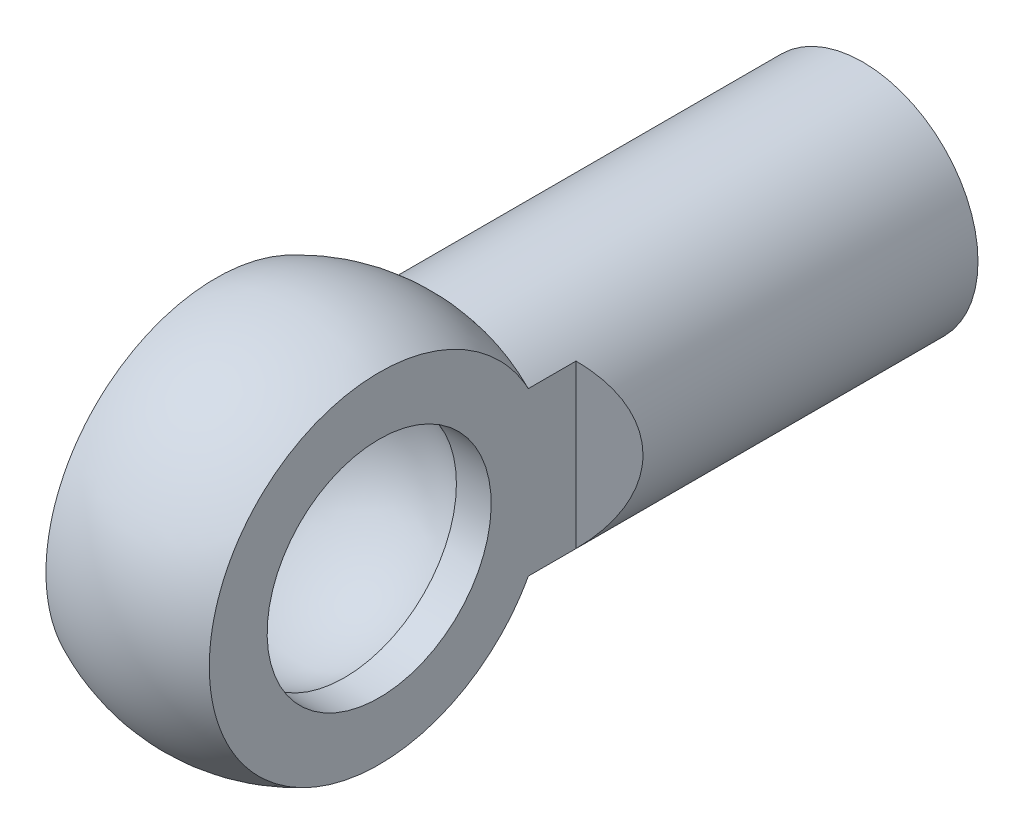
ISO-10303-21;
HEADER;
FILE_DESCRIPTION(('STEP AP214'),'2;1');
FILE_NAME('part.step','',(''),(''),'','','');
FILE_SCHEMA(('AUTOMOTIVE_DESIGN { 1 0 10303 214 1 1 1 1 }'));
ENDSEC;
DATA;
#1=APPLICATION_CONTEXT('core data for automotive mechanical design processes');
#2=APPLICATION_PROTOCOL_DEFINITION('international standard','automotive_design',2000,#1);
#3=PRODUCT_CONTEXT('',#1,'mechanical');
#4=PRODUCT('Part','Part','',(#3));
#5=PRODUCT_RELATED_PRODUCT_CATEGORY('part','',(#4));
#6=PRODUCT_DEFINITION_FORMATION('','',#4);
#7=PRODUCT_DEFINITION_CONTEXT('part definition',#1,'design');
#8=PRODUCT_DEFINITION('design','',#6,#7);
#9=PRODUCT_DEFINITION_SHAPE('','',#8);
#10=(LENGTH_UNIT() NAMED_UNIT(*) SI_UNIT(.MILLI.,.METRE.));
#11=(NAMED_UNIT(*) PLANE_ANGLE_UNIT() SI_UNIT($,.RADIAN.));
#12=(NAMED_UNIT(*) SI_UNIT($,.STERADIAN.) SOLID_ANGLE_UNIT());
#13=UNCERTAINTY_MEASURE_WITH_UNIT(LENGTH_MEASURE(1.E-05),#10,'distance_accuracy_value','');
#14=(GEOMETRIC_REPRESENTATION_CONTEXT(3) GLOBAL_UNCERTAINTY_ASSIGNED_CONTEXT((#13)) GLOBAL_UNIT_ASSIGNED_CONTEXT((#10,
#11,#12)) REPRESENTATION_CONTEXT('',''));
#15=CARTESIAN_POINT('',(0.,0.,0.));
#16=DIRECTION('',(0.,0.,1.));
#17=DIRECTION('',(1.,0.,0.));
#18=AXIS2_PLACEMENT_3D('',#15,#16,#17);
#19=CARTESIAN_POINT('',(0.,0.,0.));
#20=DIRECTION('',(0.,0.,1.));
#21=DIRECTION('',(1.,0.,0.));
#22=AXIS2_PLACEMENT_3D('',#19,#20,#21);
#23=SPHERICAL_SURFACE('',#22,4.5);
#24=CARTESIAN_POINT('',(-1.95,0.,0.));
#25=DIRECTION('',(1.,0.,0.));
#26=DIRECTION('',(0.,1.,0.));
#27=AXIS2_PLACEMENT_3D('',#24,#25,#26);
#28=CIRCLE('',#27,4.05555175037873);
#29=CARTESIAN_POINT('',(-1.95,-1.93907194296653,-3.56195171219375));
#30=VERTEX_POINT('',#29);
#31=CARTESIAN_POINT('',(-1.95,1.93907194296653,-3.56195171219375));
#32=VERTEX_POINT('',#31);
#33=EDGE_CURVE('E155',#30,#32,#28,.F.);
#34=ORIENTED_EDGE('',*,*,#33,.F.);
#35=CARTESIAN_POINT('',(0.,0.,-3.56195171219375));
#36=DIRECTION('',(0.,0.,1.));
#37=DIRECTION('',(1.,0.,0.));
#38=AXIS2_PLACEMENT_3D('',#35,#36,#37);
#39=CIRCLE('',#38,2.75);
#40=CARTESIAN_POINT('',(1.95,-1.93907194296653,-3.56195171219375));
#41=VERTEX_POINT('',#40);
#42=EDGE_CURVE('E139',#30,#41,#39,.T.);
#43=ORIENTED_EDGE('',*,*,#42,.T.);
#44=CARTESIAN_POINT('',(1.95,0.,0.));
#45=DIRECTION('',(1.,0.,0.));
#46=DIRECTION('',(0.,1.,0.));
#47=AXIS2_PLACEMENT_3D('',#44,#45,#46);
#48=CIRCLE('',#47,4.05555175037873);
#49=CARTESIAN_POINT('',(1.95,1.93907194296653,-3.56195171219375));
#50=VERTEX_POINT('',#49);
#51=EDGE_CURVE('E144',#41,#50,#48,.F.);
#52=ORIENTED_EDGE('',*,*,#51,.T.);
#53=EDGE_CURVE('E156',#50,#32,#39,.T.);
#54=ORIENTED_EDGE('',*,*,#53,.T.);
#55=EDGE_LOOP('',(#34,#43,#52,#54));
#56=FACE_BOUND('',#55,.T.);
#57=ADVANCED_FACE('F90',(#56),#23,.T.);
#58=CARTESIAN_POINT('',(0.,0.,0.));
#59=DIRECTION('',(0.,0.,1.));
#60=DIRECTION('',(1.,0.,0.));
#61=AXIS2_PLACEMENT_3D('',#58,#59,#60);
#62=CYLINDRICAL_SURFACE('',#61,2.75);
#63=DIRECTION('',(0.,0.,1.));
#64=VECTOR('',#63,1.);
#65=CARTESIAN_POINT('',(-1.95,1.93907194296653,0.));
#66=LINE('',#65,#64);
#67=CARTESIAN_POINT('',(-1.95,1.93907194296653,-4.69999999999999));
#68=VERTEX_POINT('',#67);
#69=EDGE_CURVE('E179',#32,#68,#66,.F.);
#70=ORIENTED_EDGE('',*,*,#69,.F.);
#71=ORIENTED_EDGE('',*,*,#53,.F.);
#72=DIRECTION('',(0.,0.,1.));
#73=VECTOR('',#72,1.);
#74=CARTESIAN_POINT('',(1.95,1.93907194296653,0.));
#75=LINE('',#74,#73);
#76=CARTESIAN_POINT('',(1.95,1.93907194296653,-4.7));
#77=VERTEX_POINT('',#76);
#78=EDGE_CURVE('E149',#50,#77,#75,.F.);
#79=ORIENTED_EDGE('',*,*,#78,.T.);
#80=CARTESIAN_POINT('',(0.,0.,-2.75000000000002));
#81=DIRECTION('',(0.707106781186544,0.,0.707106781186551));
#82=DIRECTION('',(-0.707106781186551,0.,0.707106781186544));
#83=AXIS2_PLACEMENT_3D('',#80,#81,#82);
#84=ELLIPSE('',#83,3.88908729652599,2.75);
#85=CARTESIAN_POINT('',(2.75000000000001,0.,-5.5));
#86=VERTEX_POINT('',#85);
#87=EDGE_CURVE('E110',#77,#86,#84,.F.);
#88=ORIENTED_EDGE('',*,*,#87,.T.);
#89=CARTESIAN_POINT('',(0.,0.,-2.75000000000002));
#90=DIRECTION('',(0.707106781186544,0.,0.707106781186551));
#91=DIRECTION('',(-0.707106781186551,0.,0.707106781186544));
#92=AXIS2_PLACEMENT_3D('',#89,#90,#91);
#93=ELLIPSE('',#92,3.88908729652599,2.75);
#94=CARTESIAN_POINT('',(1.95,-1.93907194296653,-4.7));
#95=VERTEX_POINT('',#94);
#96=EDGE_CURVE('E140',#86,#95,#93,.F.);
#97=ORIENTED_EDGE('',*,*,#96,.T.);
#98=DIRECTION('',(0.,0.,1.));
#99=VECTOR('',#98,1.);
#100=CARTESIAN_POINT('',(1.95,-1.93907194296653,0.));
#101=LINE('',#100,#99);
#102=EDGE_CURVE('E133',#95,#41,#101,.T.);
#103=ORIENTED_EDGE('',*,*,#102,.T.);
#104=ORIENTED_EDGE('',*,*,#42,.F.);
#105=DIRECTION('',(0.,0.,1.));
#106=VECTOR('',#105,1.);
#107=CARTESIAN_POINT('',(-1.95,-1.93907194296653,0.));
#108=LINE('',#107,#106);
#109=CARTESIAN_POINT('',(-1.95,-1.93907194296653,-4.69999999999999));
#110=VERTEX_POINT('',#109);
#111=EDGE_CURVE('E168',#110,#30,#108,.T.);
#112=ORIENTED_EDGE('',*,*,#111,.F.);
#113=CARTESIAN_POINT('',(0.,0.,-2.74999999999997));
#114=DIRECTION('',(0.707106781186551,0.,-0.707106781186544));
#115=DIRECTION('',(0.707106781186544,0.,0.707106781186551));
#116=AXIS2_PLACEMENT_3D('',#113,#114,#115);
#117=ELLIPSE('',#116,3.88908729652603,2.75);
#118=CARTESIAN_POINT('',(-2.75,0.,-5.5));
#119=VERTEX_POINT('',#118);
#120=EDGE_CURVE('E98',#110,#119,#117,.T.);
#121=ORIENTED_EDGE('',*,*,#120,.T.);
#122=CARTESIAN_POINT('',(0.,0.,-2.74999999999997));
#123=DIRECTION('',(0.707106781186551,0.,-0.707106781186544));
#124=DIRECTION('',(0.707106781186544,0.,0.707106781186551));
#125=AXIS2_PLACEMENT_3D('',#122,#123,#124);
#126=ELLIPSE('',#125,3.88908729652603,2.75);
#127=EDGE_CURVE('E13',#119,#68,#126,.T.);
#128=ORIENTED_EDGE('',*,*,#127,.T.);
#129=EDGE_LOOP('',(#70,#71,#79,#88,#97,#103,#104,#112,#121,#128));
#130=FACE_BOUND('',#129,.T.);
#131=CARTESIAN_POINT('',(0.,0.,-13.5));
#132=DIRECTION('',(0.,0.,1.));
#133=DIRECTION('',(1.,0.,0.));
#134=AXIS2_PLACEMENT_3D('',#131,#132,#133);
#135=CIRCLE('',#134,2.75);
#136=CARTESIAN_POINT('',(2.75,0.,-13.5));
#137=VERTEX_POINT('',#136);
#138=EDGE_CURVE('E157',#137,#137,#135,.T.);
#139=ORIENTED_EDGE('',*,*,#138,.T.);
#140=EDGE_LOOP('',(#139));
#141=FACE_BOUND('',#140,.T.);
#142=ADVANCED_FACE('F136',(#130,#141),#62,.T.);
#143=CARTESIAN_POINT('',(0.,0.,-13.5));
#144=DIRECTION('',(0.,0.,1.));
#145=DIRECTION('',(1.,0.,0.));
#146=AXIS2_PLACEMENT_3D('',#143,#144,#145);
#147=PLANE('',#146);
#148=ORIENTED_EDGE('',*,*,#138,.F.);
#149=EDGE_LOOP('',(#148));
#150=FACE_BOUND('',#149,.T.);
#151=CARTESIAN_POINT('',(0.,0.,-13.5));
#152=DIRECTION('',(0.,0.,1.));
#153=DIRECTION('',(1.,0.,0.));
#154=AXIS2_PLACEMENT_3D('',#151,#152,#153);
#155=CIRCLE('',#154,1.5);
#156=CARTESIAN_POINT('',(1.5,0.,-13.5));
#157=VERTEX_POINT('',#156);
#158=EDGE_CURVE('E161',#157,#157,#155,.T.);
#159=ORIENTED_EDGE('',*,*,#158,.T.);
#160=EDGE_LOOP('',(#159));
#161=FACE_BOUND('',#160,.T.);
#162=ADVANCED_FACE('F191',(#150,#161),#147,.F.);
#163=CARTESIAN_POINT('',(0.,0.,0.));
#164=DIRECTION('',(0.,0.,1.));
#165=DIRECTION('',(1.,0.,0.));
#166=AXIS2_PLACEMENT_3D('',#163,#164,#165);
#167=CYLINDRICAL_SURFACE('',#166,1.5);
#168=ORIENTED_EDGE('',*,*,#158,.F.);
#169=EDGE_LOOP('',(#168));
#170=FACE_BOUND('',#169,.T.);
#171=CARTESIAN_POINT('',(0.,0.,-4.5));
#172=DIRECTION('',(0.,0.,1.));
#173=DIRECTION('',(1.,0.,0.));
#174=AXIS2_PLACEMENT_3D('',#171,#172,#173);
#175=CIRCLE('',#174,1.5);
#176=CARTESIAN_POINT('',(1.5,0.,-4.5));
#177=VERTEX_POINT('',#176);
#178=EDGE_CURVE('E186',#177,#177,#175,.T.);
#179=ORIENTED_EDGE('',*,*,#178,.T.);
#180=EDGE_LOOP('',(#179));
#181=FACE_BOUND('',#180,.T.);
#182=ADVANCED_FACE('F193',(#170,#181),#167,.F.);
#183=CARTESIAN_POINT('',(0.,0.,-4.5));
#184=DIRECTION('',(0.,0.,1.));
#185=DIRECTION('',(1.,0.,0.));
#186=AXIS2_PLACEMENT_3D('',#183,#184,#185);
#187=PLANE('',#186);
#188=ORIENTED_EDGE('',*,*,#178,.F.);
#189=EDGE_LOOP('',(#188));
#190=FACE_BOUND('',#189,.T.);
#191=ADVANCED_FACE('F196',(#190),#187,.F.);
#192=CARTESIAN_POINT('',(1.95,5.,5.5));
#193=DIRECTION('',(1.,0.,0.));
#194=DIRECTION('',(0.,1.,0.));
#195=AXIS2_PLACEMENT_3D('',#192,#193,#194);
#196=PLANE('',#195);
#197=CARTESIAN_POINT('',(1.95,0.,0.));
#198=DIRECTION('',(1.,0.,0.));
#199=DIRECTION('',(0.,1.,0.));
#200=AXIS2_PLACEMENT_3D('',#197,#198,#199);
#201=CIRCLE('',#200,2.675);
#202=CARTESIAN_POINT('',(1.95,2.675,0.));
#203=VERTEX_POINT('',#202);
#204=EDGE_CURVE('E274',#203,#203,#201,.T.);
#205=ORIENTED_EDGE('',*,*,#204,.F.);
#206=EDGE_LOOP('',(#205));
#207=FACE_BOUND('',#206,.T.);
#208=ORIENTED_EDGE('',*,*,#102,.F.);
#209=DIRECTION('',(0.,1.,0.));
#210=VECTOR('',#209,1.);
#211=CARTESIAN_POINT('',(1.95,1.93907194296653,-4.7));
#212=LINE('',#211,#210);
#213=EDGE_CURVE('E159',#95,#77,#212,.T.);
#214=ORIENTED_EDGE('',*,*,#213,.T.);
#215=ORIENTED_EDGE('',*,*,#78,.F.);
#216=ORIENTED_EDGE('',*,*,#51,.F.);
#217=EDGE_LOOP('',(#208,#214,#215,#216));
#218=FACE_BOUND('',#217,.T.);
#219=ADVANCED_FACE('F148',(#207,#218),#196,.T.);
#220=CARTESIAN_POINT('',(-1.95,5.,5.5));
#221=DIRECTION('',(1.,0.,0.));
#222=DIRECTION('',(0.,1.,0.));
#223=AXIS2_PLACEMENT_3D('',#220,#221,#222);
#224=PLANE('',#223);
#225=ORIENTED_EDGE('',*,*,#69,.T.);
#226=DIRECTION('',(0.,-1.,0.));
#227=VECTOR('',#226,1.);
#228=CARTESIAN_POINT('',(-1.95,5.,-4.69999999999999));
#229=LINE('',#228,#227);
#230=EDGE_CURVE('E170',#68,#110,#229,.T.);
#231=ORIENTED_EDGE('',*,*,#230,.T.);
#232=ORIENTED_EDGE('',*,*,#111,.T.);
#233=ORIENTED_EDGE('',*,*,#33,.T.);
#234=EDGE_LOOP('',(#225,#231,#232,#233));
#235=FACE_BOUND('',#234,.T.);
#236=CARTESIAN_POINT('',(-1.95,0.,0.));
#237=DIRECTION('',(1.,0.,0.));
#238=DIRECTION('',(0.,1.,0.));
#239=AXIS2_PLACEMENT_3D('',#236,#237,#238);
#240=CIRCLE('',#239,2.14650879336657);
#241=CARTESIAN_POINT('',(-1.95,2.14650879336657,0.));
#242=VERTEX_POINT('',#241);
#243=EDGE_CURVE('E165',#242,#242,#240,.F.);
#244=ORIENTED_EDGE('',*,*,#243,.F.);
#245=EDGE_LOOP('',(#244));
#246=FACE_BOUND('',#245,.T.);
#247=ADVANCED_FACE('F177',(#235,#246),#224,.F.);
#248=CARTESIAN_POINT('',(0.,0.,0.));
#249=DIRECTION('',(0.,0.,1.));
#250=DIRECTION('',(1.,0.,0.));
#251=AXIS2_PLACEMENT_3D('',#248,#249,#250);
#252=SPHERICAL_SURFACE('',#251,2.9);
#253=CARTESIAN_POINT('',(0.,0.,0.));
#254=DIRECTION('',(-1.,0.,0.));
#255=DIRECTION('',(0.,-1.,0.));
#256=AXIS2_PLACEMENT_3D('',#253,#254,#255);
#257=SPHERICAL_SURFACE('',#256,2.9);
#258=CARTESIAN_POINT('',(1.11998883923011,0.,0.));
#259=DIRECTION('',(-1.,0.,0.));
#260=DIRECTION('',(0.,-1.,0.));
#261=AXIS2_PLACEMENT_3D('',#258,#259,#260);
#262=CIRCLE('',#261,2.675);
#263=CARTESIAN_POINT('',(1.11998883923011,-2.675,0.));
#264=VERTEX_POINT('',#263);
#265=EDGE_CURVE('E145',#264,#264,#262,.T.);
#266=ORIENTED_EDGE('',*,*,#265,.F.);
#267=EDGE_LOOP('',(#266));
#268=FACE_BOUND('',#267,.T.);
#269=ORIENTED_EDGE('',*,*,#243,.T.);
#270=EDGE_LOOP('',(#269));
#271=FACE_BOUND('',#270,.T.);
#272=ADVANCED_FACE('F215',(#268,#271),#257,.F.);
#273=CARTESIAN_POINT('',(2.75000000000001,0.,-5.5));
#274=DIRECTION('',(0.707106781186544,0.,0.707106781186551));
#275=DIRECTION('',(0.,1.,0.));
#276=AXIS2_PLACEMENT_3D('',#273,#274,#275);
#277=PLANE('',#276);
#278=ORIENTED_EDGE('',*,*,#87,.F.);
#279=ORIENTED_EDGE('',*,*,#213,.F.);
#280=ORIENTED_EDGE('',*,*,#96,.F.);
#281=EDGE_LOOP('',(#278,#279,#280));
#282=FACE_BOUND('',#281,.T.);
#283=ADVANCED_FACE('F217',(#282),#277,.T.);
#284=CARTESIAN_POINT('',(-1.95,5.,-4.69999999999999));
#285=DIRECTION('',(0.707106781186551,0.,-0.707106781186544));
#286=DIRECTION('',(0.,-1.,0.));
#287=AXIS2_PLACEMENT_3D('',#284,#285,#286);
#288=PLANE('',#287);
#289=ORIENTED_EDGE('',*,*,#230,.F.);
#290=ORIENTED_EDGE('',*,*,#127,.F.);
#291=ORIENTED_EDGE('',*,*,#120,.F.);
#292=EDGE_LOOP('',(#289,#290,#291));
#293=FACE_BOUND('',#292,.T.);
#294=ADVANCED_FACE('F92',(#293),#288,.F.);
#295=CARTESIAN_POINT('',(-2.751,0.,0.));
#296=DIRECTION('',(1.,0.,0.));
#297=DIRECTION('',(0.,1.,0.));
#298=AXIS2_PLACEMENT_3D('',#295,#296,#297);
#299=CYLINDRICAL_SURFACE('',#298,2.675);
#300=ORIENTED_EDGE('',*,*,#204,.T.);
#301=EDGE_LOOP('',(#300));
#302=FACE_BOUND('',#301,.T.);
#303=ORIENTED_EDGE('',*,*,#265,.T.);
#304=EDGE_LOOP('',(#303));
#305=FACE_BOUND('',#304,.T.);
#306=ADVANCED_FACE('F225',(#302,#305),#299,.F.);
#307=CLOSED_SHELL('',(#57,#142,#162,#182,#191,#219,#247,#272,#283,#294,#306));
#308=MANIFOLD_SOLID_BREP('B2',#307);
#309=ADVANCED_BREP_SHAPE_REPRESENTATION('',(#18,#308),#14);
#310=SHAPE_DEFINITION_REPRESENTATION(#9,#309);
ENDSEC;
END-ISO-10303-21;
